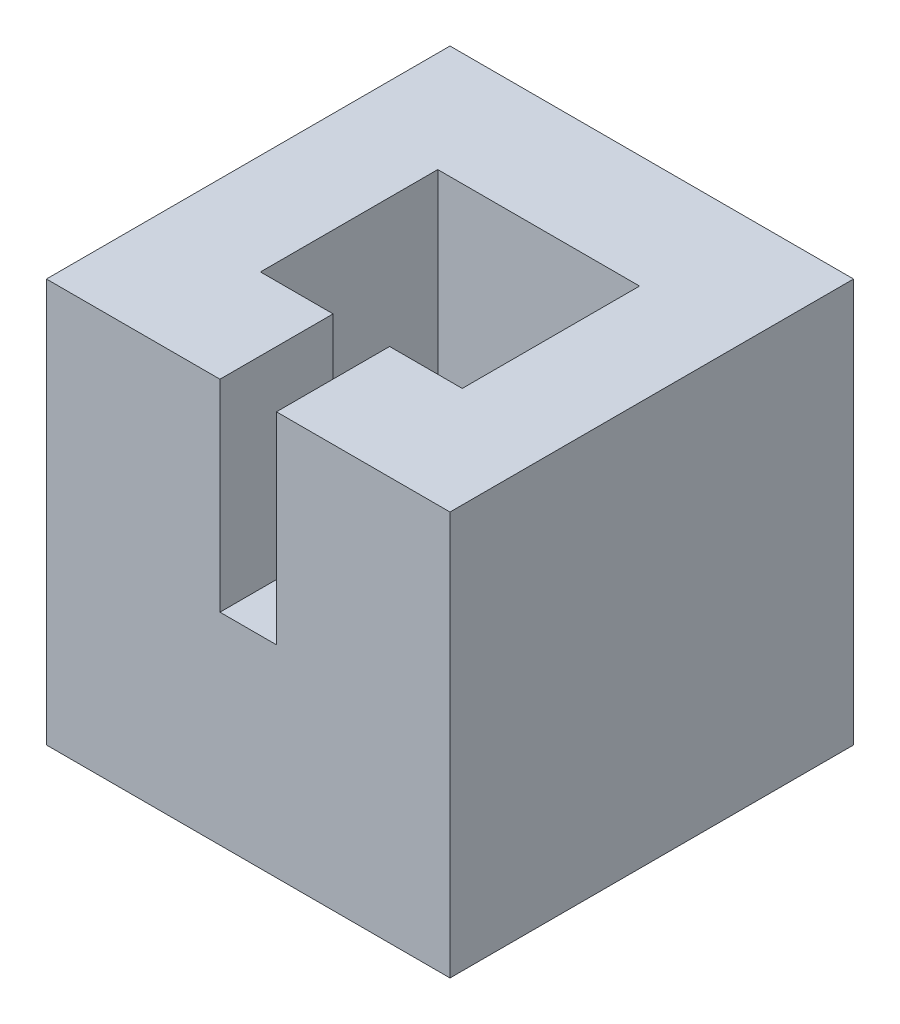
ISO-10303-21;
HEADER;
FILE_DESCRIPTION(('STEP AP214'),'2;1');
FILE_NAME('part.step','',(''),(''),'','','');
FILE_SCHEMA(('AUTOMOTIVE_DESIGN { 1 0 10303 214 1 1 1 1 }'));
ENDSEC;
DATA;
#1=APPLICATION_CONTEXT('core data for automotive mechanical design processes');
#2=APPLICATION_PROTOCOL_DEFINITION('international standard','automotive_design',2000,#1);
#3=PRODUCT_CONTEXT('',#1,'mechanical');
#4=PRODUCT('Part','Part','',(#3));
#5=PRODUCT_RELATED_PRODUCT_CATEGORY('part','',(#4));
#6=PRODUCT_DEFINITION_FORMATION('','',#4);
#7=PRODUCT_DEFINITION_CONTEXT('part definition',#1,'design');
#8=PRODUCT_DEFINITION('design','',#6,#7);
#9=PRODUCT_DEFINITION_SHAPE('','',#8);
#10=(LENGTH_UNIT() NAMED_UNIT(*) SI_UNIT(.MILLI.,.METRE.));
#11=(NAMED_UNIT(*) PLANE_ANGLE_UNIT() SI_UNIT($,.RADIAN.));
#12=(NAMED_UNIT(*) SI_UNIT($,.STERADIAN.) SOLID_ANGLE_UNIT());
#13=UNCERTAINTY_MEASURE_WITH_UNIT(LENGTH_MEASURE(1.E-05),#10,'distance_accuracy_value','');
#14=(GEOMETRIC_REPRESENTATION_CONTEXT(3) GLOBAL_UNCERTAINTY_ASSIGNED_CONTEXT((#13)) GLOBAL_UNIT_ASSIGNED_CONTEXT((#10,
#11,#12)) REPRESENTATION_CONTEXT('',''));
#15=CARTESIAN_POINT('',(0.,0.,0.));
#16=DIRECTION('',(0.,0.,1.));
#17=DIRECTION('',(1.,0.,0.));
#18=AXIS2_PLACEMENT_3D('',#15,#16,#17);
#19=CARTESIAN_POINT('',(6.35,12.7,6.35));
#20=DIRECTION('',(-1.,0.,0.));
#21=DIRECTION('',(0.,0.,1.));
#22=AXIS2_PLACEMENT_3D('',#19,#20,#21);
#23=PLANE('',#22);
#24=DIRECTION('',(0.,0.,-1.));
#25=VECTOR('',#24,1.);
#26=CARTESIAN_POINT('',(6.35,0.,6.35));
#27=LINE('',#26,#25);
#28=CARTESIAN_POINT('',(6.35,0.,6.35));
#29=VERTEX_POINT('',#28);
#30=CARTESIAN_POINT('',(6.35,0.,-6.35));
#31=VERTEX_POINT('',#30);
#32=EDGE_CURVE('E188',#29,#31,#27,.T.);
#33=ORIENTED_EDGE('',*,*,#32,.T.);
#34=DIRECTION('',(0.,-1.,0.));
#35=VECTOR('',#34,1.);
#36=CARTESIAN_POINT('',(6.35,12.7,-6.35));
#37=LINE('',#36,#35);
#38=CARTESIAN_POINT('',(6.35,12.7,-6.35));
#39=VERTEX_POINT('',#38);
#40=EDGE_CURVE('E11',#39,#31,#37,.T.);
#41=ORIENTED_EDGE('',*,*,#40,.F.);
#42=DIRECTION('',(0.,0.,-1.));
#43=VECTOR('',#42,1.);
#44=CARTESIAN_POINT('',(6.35,12.7,6.35));
#45=LINE('',#44,#43);
#46=CARTESIAN_POINT('',(6.35,12.7,6.35));
#47=VERTEX_POINT('',#46);
#48=EDGE_CURVE('E201',#47,#39,#45,.T.);
#49=ORIENTED_EDGE('',*,*,#48,.F.);
#50=DIRECTION('',(0.,-1.,0.));
#51=VECTOR('',#50,1.);
#52=CARTESIAN_POINT('',(6.35,12.7,6.35));
#53=LINE('',#52,#51);
#54=EDGE_CURVE('E209',#47,#29,#53,.T.);
#55=ORIENTED_EDGE('',*,*,#54,.T.);
#56=EDGE_LOOP('',(#33,#41,#49,#55));
#57=FACE_BOUND('',#56,.T.);
#58=ADVANCED_FACE('F37',(#57),#23,.F.);
#59=CARTESIAN_POINT('',(-6.35,12.7,-6.35));
#60=DIRECTION('',(0.,0.,1.));
#61=DIRECTION('',(1.,0.,0.));
#62=AXIS2_PLACEMENT_3D('',#59,#60,#61);
#63=PLANE('',#62);
#64=DIRECTION('',(-1.,0.,0.));
#65=VECTOR('',#64,1.);
#66=CARTESIAN_POINT('',(-6.35,0.,-6.35));
#67=LINE('',#66,#65);
#68=CARTESIAN_POINT('',(-6.35,0.,-6.35));
#69=VERTEX_POINT('',#68);
#70=EDGE_CURVE('E212',#31,#69,#67,.T.);
#71=ORIENTED_EDGE('',*,*,#70,.T.);
#72=DIRECTION('',(0.,-1.,0.));
#73=VECTOR('',#72,1.);
#74=CARTESIAN_POINT('',(-6.35,12.7,-6.35));
#75=LINE('',#74,#73);
#76=CARTESIAN_POINT('',(-6.35,12.7,-6.35));
#77=VERTEX_POINT('',#76);
#78=EDGE_CURVE('E44',#77,#69,#75,.T.);
#79=ORIENTED_EDGE('',*,*,#78,.F.);
#80=DIRECTION('',(-1.,0.,0.));
#81=VECTOR('',#80,1.);
#82=CARTESIAN_POINT('',(-6.35,12.7,-6.35));
#83=LINE('',#82,#81);
#84=EDGE_CURVE('E89',#39,#77,#83,.T.);
#85=ORIENTED_EDGE('',*,*,#84,.F.);
#86=ORIENTED_EDGE('',*,*,#40,.T.);
#87=EDGE_LOOP('',(#71,#79,#85,#86));
#88=FACE_BOUND('',#87,.T.);
#89=ADVANCED_FACE('F262',(#88),#63,.F.);
#90=CARTESIAN_POINT('',(-6.35,12.7,6.35));
#91=DIRECTION('',(1.,0.,0.));
#92=DIRECTION('',(0.,0.,-1.));
#93=AXIS2_PLACEMENT_3D('',#90,#91,#92);
#94=PLANE('',#93);
#95=DIRECTION('',(0.,0.,1.));
#96=VECTOR('',#95,1.);
#97=CARTESIAN_POINT('',(-6.35,0.,6.35));
#98=LINE('',#97,#96);
#99=CARTESIAN_POINT('',(-6.35,0.,6.35));
#100=VERTEX_POINT('',#99);
#101=EDGE_CURVE('E214',#69,#100,#98,.T.);
#102=ORIENTED_EDGE('',*,*,#101,.T.);
#103=DIRECTION('',(0.,-1.,0.));
#104=VECTOR('',#103,1.);
#105=CARTESIAN_POINT('',(-6.35,12.7,6.35));
#106=LINE('',#105,#104);
#107=CARTESIAN_POINT('',(-6.35,12.7,6.35));
#108=VERTEX_POINT('',#107);
#109=EDGE_CURVE('E218',#108,#100,#106,.T.);
#110=ORIENTED_EDGE('',*,*,#109,.F.);
#111=DIRECTION('',(0.,0.,1.));
#112=VECTOR('',#111,1.);
#113=CARTESIAN_POINT('',(-6.35,12.7,6.35));
#114=LINE('',#113,#112);
#115=EDGE_CURVE('E204',#77,#108,#114,.T.);
#116=ORIENTED_EDGE('',*,*,#115,.F.);
#117=ORIENTED_EDGE('',*,*,#78,.T.);
#118=EDGE_LOOP('',(#102,#110,#116,#117));
#119=FACE_BOUND('',#118,.T.);
#120=ADVANCED_FACE('F223',(#119),#94,.F.);
#121=CARTESIAN_POINT('',(-6.35,12.7,6.35));
#122=DIRECTION('',(0.,0.,-1.));
#123=DIRECTION('',(-1.,0.,0.));
#124=AXIS2_PLACEMENT_3D('',#121,#122,#123);
#125=PLANE('',#124);
#126=DIRECTION('',(1.,0.,0.));
#127=VECTOR('',#126,1.);
#128=CARTESIAN_POINT('',(-6.35,12.7,6.35));
#129=LINE('',#128,#127);
#130=CARTESIAN_POINT('',(0.889,12.7,6.35));
#131=VERTEX_POINT('',#130);
#132=EDGE_CURVE('E60',#131,#47,#129,.T.);
#133=ORIENTED_EDGE('',*,*,#132,.F.);
#134=DIRECTION('',(0.,1.,0.));
#135=VECTOR('',#134,1.);
#136=CARTESIAN_POINT('',(0.889,6.35000000000001,6.35));
#137=LINE('',#136,#135);
#138=CARTESIAN_POINT('',(0.889,6.35000000000001,6.35));
#139=VERTEX_POINT('',#138);
#140=EDGE_CURVE('E191',#139,#131,#137,.T.);
#141=ORIENTED_EDGE('',*,*,#140,.F.);
#142=DIRECTION('',(1.,0.,0.));
#143=VECTOR('',#142,1.);
#144=CARTESIAN_POINT('',(0.,6.35000000000001,6.35));
#145=LINE('',#144,#143);
#146=CARTESIAN_POINT('',(-0.889,6.35000000000001,6.35));
#147=VERTEX_POINT('',#146);
#148=EDGE_CURVE('E169',#147,#139,#145,.T.);
#149=ORIENTED_EDGE('',*,*,#148,.F.);
#150=DIRECTION('',(0.,1.,0.));
#151=VECTOR('',#150,1.);
#152=CARTESIAN_POINT('',(-0.889,6.35000000000001,6.35));
#153=LINE('',#152,#151);
#154=CARTESIAN_POINT('',(-0.889,12.7,6.35));
#155=VERTEX_POINT('',#154);
#156=EDGE_CURVE('E193',#147,#155,#153,.T.);
#157=ORIENTED_EDGE('',*,*,#156,.T.);
#158=EDGE_CURVE('E206',#108,#155,#129,.T.);
#159=ORIENTED_EDGE('',*,*,#158,.F.);
#160=ORIENTED_EDGE('',*,*,#109,.T.);
#161=DIRECTION('',(1.,0.,0.));
#162=VECTOR('',#161,1.);
#163=CARTESIAN_POINT('',(-6.35,0.,6.35));
#164=LINE('',#163,#162);
#165=EDGE_CURVE('E82',#100,#29,#164,.T.);
#166=ORIENTED_EDGE('',*,*,#165,.T.);
#167=ORIENTED_EDGE('',*,*,#54,.F.);
#168=EDGE_LOOP('',(#133,#141,#149,#157,#159,#160,#166,#167));
#169=FACE_BOUND('',#168,.T.);
#170=ADVANCED_FACE('F231',(#169),#125,.F.);
#171=CARTESIAN_POINT('',(0.,12.7,0.));
#172=DIRECTION('',(0.,-1.,0.));
#173=DIRECTION('',(0.,0.,-1.));
#174=AXIS2_PLACEMENT_3D('',#171,#172,#173);
#175=PLANE('',#174);
#176=DIRECTION('',(1.,0.,0.));
#177=VECTOR('',#176,1.);
#178=CARTESIAN_POINT('',(0.,12.7,2.7899975875471));
#179=LINE('',#178,#177);
#180=CARTESIAN_POINT('',(0.889,12.7,2.7899975875471));
#181=VERTEX_POINT('',#180);
#182=CARTESIAN_POINT('',(3.175,12.7,2.7899975875471));
#183=VERTEX_POINT('',#182);
#184=EDGE_CURVE('E156',#181,#183,#179,.T.);
#185=ORIENTED_EDGE('',*,*,#184,.F.);
#186=DIRECTION('',(0.,0.,-1.));
#187=VECTOR('',#186,1.);
#188=CARTESIAN_POINT('',(0.889,12.7,0.));
#189=LINE('',#188,#187);
#190=EDGE_CURVE('E159',#131,#181,#189,.T.);
#191=ORIENTED_EDGE('',*,*,#190,.F.);
#192=ORIENTED_EDGE('',*,*,#132,.T.);
#193=ORIENTED_EDGE('',*,*,#48,.T.);
#194=ORIENTED_EDGE('',*,*,#84,.T.);
#195=ORIENTED_EDGE('',*,*,#115,.T.);
#196=ORIENTED_EDGE('',*,*,#158,.T.);
#197=DIRECTION('',(0.,0.,-1.));
#198=VECTOR('',#197,1.);
#199=CARTESIAN_POINT('',(-0.889,12.7,0.));
#200=LINE('',#199,#198);
#201=CARTESIAN_POINT('',(-0.889,12.7,2.7899975875471));
#202=VERTEX_POINT('',#201);
#203=EDGE_CURVE('E181',#155,#202,#200,.T.);
#204=ORIENTED_EDGE('',*,*,#203,.T.);
#205=CARTESIAN_POINT('',(-3.175,12.7,2.7899975875471));
#206=VERTEX_POINT('',#205);
#207=EDGE_CURVE('E161',#206,#202,#179,.T.);
#208=ORIENTED_EDGE('',*,*,#207,.F.);
#209=DIRECTION('',(0.,0.,1.));
#210=VECTOR('',#209,1.);
#211=CARTESIAN_POINT('',(-3.175,12.7,0.));
#212=LINE('',#211,#210);
#213=CARTESIAN_POINT('',(-3.175,12.7,-2.7899975875471));
#214=VERTEX_POINT('',#213);
#215=EDGE_CURVE('E177',#214,#206,#212,.T.);
#216=ORIENTED_EDGE('',*,*,#215,.F.);
#217=DIRECTION('',(1.,0.,0.));
#218=VECTOR('',#217,1.);
#219=CARTESIAN_POINT('',(0.,12.7,-2.7899975875471));
#220=LINE('',#219,#218);
#221=CARTESIAN_POINT('',(3.175,12.7,-2.7899975875471));
#222=VERTEX_POINT('',#221);
#223=EDGE_CURVE('E175',#214,#222,#220,.T.);
#224=ORIENTED_EDGE('',*,*,#223,.T.);
#225=DIRECTION('',(0.,0.,1.));
#226=VECTOR('',#225,1.);
#227=CARTESIAN_POINT('',(3.175,12.7,0.));
#228=LINE('',#227,#226);
#229=EDGE_CURVE('E51',#222,#183,#228,.T.);
#230=ORIENTED_EDGE('',*,*,#229,.T.);
#231=EDGE_LOOP('',(#185,#191,#192,#193,#194,#195,#196,#204,#208,#216,#224,#230));
#232=FACE_BOUND('',#231,.T.);
#233=ADVANCED_FACE('F237',(#232),#175,.F.);
#234=CARTESIAN_POINT('',(0.,0.,0.));
#235=DIRECTION('',(0.,-1.,0.));
#236=DIRECTION('',(0.,0.,-1.));
#237=AXIS2_PLACEMENT_3D('',#234,#235,#236);
#238=PLANE('',#237);
#239=ORIENTED_EDGE('',*,*,#32,.F.);
#240=ORIENTED_EDGE('',*,*,#165,.F.);
#241=ORIENTED_EDGE('',*,*,#101,.F.);
#242=ORIENTED_EDGE('',*,*,#70,.F.);
#243=EDGE_LOOP('',(#239,#240,#241,#242));
#244=FACE_BOUND('',#243,.T.);
#245=ADVANCED_FACE('F227',(#244),#238,.T.);
#246=CARTESIAN_POINT('',(3.175,6.35000000000001,0.));
#247=DIRECTION('',(-1.,0.,0.));
#248=DIRECTION('',(0.,0.,1.));
#249=AXIS2_PLACEMENT_3D('',#246,#247,#248);
#250=PLANE('',#249);
#251=ORIENTED_EDGE('',*,*,#229,.F.);
#252=DIRECTION('',(0.,1.,0.));
#253=VECTOR('',#252,1.);
#254=CARTESIAN_POINT('',(3.175,6.35000000000001,-2.7899975875471));
#255=LINE('',#254,#253);
#256=CARTESIAN_POINT('',(3.175,6.35000000000001,-2.7899975875471));
#257=VERTEX_POINT('',#256);
#258=EDGE_CURVE('E138',#257,#222,#255,.T.);
#259=ORIENTED_EDGE('',*,*,#258,.F.);
#260=DIRECTION('',(0.,0.,1.));
#261=VECTOR('',#260,1.);
#262=CARTESIAN_POINT('',(3.175,6.35000000000001,0.));
#263=LINE('',#262,#261);
#264=CARTESIAN_POINT('',(3.175,6.35000000000001,2.7899975875471));
#265=VERTEX_POINT('',#264);
#266=EDGE_CURVE('E146',#257,#265,#263,.T.);
#267=ORIENTED_EDGE('',*,*,#266,.T.);
#268=DIRECTION('',(0.,1.,0.));
#269=VECTOR('',#268,1.);
#270=CARTESIAN_POINT('',(3.175,6.35000000000001,2.7899975875471));
#271=LINE('',#270,#269);
#272=EDGE_CURVE('E186',#265,#183,#271,.T.);
#273=ORIENTED_EDGE('',*,*,#272,.T.);
#274=EDGE_LOOP('',(#251,#259,#267,#273));
#275=FACE_BOUND('',#274,.T.);
#276=ADVANCED_FACE('F148',(#275),#250,.T.);
#277=CARTESIAN_POINT('',(0.,6.35000000000001,2.7899975875471));
#278=DIRECTION('',(0.,0.,1.));
#279=DIRECTION('',(1.,0.,0.));
#280=AXIS2_PLACEMENT_3D('',#277,#278,#279);
#281=PLANE('',#280);
#282=ORIENTED_EDGE('',*,*,#184,.T.);
#283=ORIENTED_EDGE('',*,*,#272,.F.);
#284=DIRECTION('',(1.,0.,0.));
#285=VECTOR('',#284,1.);
#286=CARTESIAN_POINT('',(0.,6.35000000000001,2.7899975875471));
#287=LINE('',#286,#285);
#288=CARTESIAN_POINT('',(0.889,6.35000000000001,2.7899975875471));
#289=VERTEX_POINT('',#288);
#290=EDGE_CURVE('E150',#289,#265,#287,.T.);
#291=ORIENTED_EDGE('',*,*,#290,.F.);
#292=DIRECTION('',(0.,1.,0.));
#293=VECTOR('',#292,1.);
#294=CARTESIAN_POINT('',(0.889,6.35000000000001,2.7899975875471));
#295=LINE('',#294,#293);
#296=EDGE_CURVE('E189',#289,#181,#295,.T.);
#297=ORIENTED_EDGE('',*,*,#296,.T.);
#298=EDGE_LOOP('',(#282,#283,#291,#297));
#299=FACE_BOUND('',#298,.T.);
#300=ADVANCED_FACE('F239',(#299),#281,.F.);
#301=CARTESIAN_POINT('',(0.889,6.35000000000001,0.));
#302=DIRECTION('',(1.,0.,0.));
#303=DIRECTION('',(0.,0.,-1.));
#304=AXIS2_PLACEMENT_3D('',#301,#302,#303);
#305=PLANE('',#304);
#306=ORIENTED_EDGE('',*,*,#190,.T.);
#307=ORIENTED_EDGE('',*,*,#296,.F.);
#308=DIRECTION('',(0.,0.,-1.));
#309=VECTOR('',#308,1.);
#310=CARTESIAN_POINT('',(0.889,6.35000000000001,0.));
#311=LINE('',#310,#309);
#312=EDGE_CURVE('E172',#139,#289,#311,.T.);
#313=ORIENTED_EDGE('',*,*,#312,.F.);
#314=ORIENTED_EDGE('',*,*,#140,.T.);
#315=EDGE_LOOP('',(#306,#307,#313,#314));
#316=FACE_BOUND('',#315,.T.);
#317=ADVANCED_FACE('F235',(#316),#305,.F.);
#318=CARTESIAN_POINT('',(-0.889,6.35000000000001,0.));
#319=DIRECTION('',(1.,0.,0.));
#320=DIRECTION('',(0.,0.,-1.));
#321=AXIS2_PLACEMENT_3D('',#318,#319,#320);
#322=PLANE('',#321);
#323=ORIENTED_EDGE('',*,*,#203,.F.);
#324=ORIENTED_EDGE('',*,*,#156,.F.);
#325=DIRECTION('',(0.,0.,-1.));
#326=VECTOR('',#325,1.);
#327=CARTESIAN_POINT('',(-0.889,6.35000000000001,0.));
#328=LINE('',#327,#326);
#329=CARTESIAN_POINT('',(-0.889,6.35000000000001,2.7899975875471));
#330=VERTEX_POINT('',#329);
#331=EDGE_CURVE('E167',#147,#330,#328,.T.);
#332=ORIENTED_EDGE('',*,*,#331,.T.);
#333=DIRECTION('',(0.,1.,0.));
#334=VECTOR('',#333,1.);
#335=CARTESIAN_POINT('',(-0.889,6.35000000000001,2.7899975875471));
#336=LINE('',#335,#334);
#337=EDGE_CURVE('E196',#330,#202,#336,.T.);
#338=ORIENTED_EDGE('',*,*,#337,.T.);
#339=EDGE_LOOP('',(#323,#324,#332,#338));
#340=FACE_BOUND('',#339,.T.);
#341=ADVANCED_FACE('F244',(#340),#322,.T.);
#342=ORIENTED_EDGE('',*,*,#207,.T.);
#343=ORIENTED_EDGE('',*,*,#337,.F.);
#344=CARTESIAN_POINT('',(-3.175,6.35000000000001,2.7899975875471));
#345=VERTEX_POINT('',#344);
#346=EDGE_CURVE('E164',#345,#330,#287,.T.);
#347=ORIENTED_EDGE('',*,*,#346,.F.);
#348=DIRECTION('',(0.,1.,0.));
#349=VECTOR('',#348,1.);
#350=CARTESIAN_POINT('',(-3.175,6.35000000000001,2.7899975875471));
#351=LINE('',#350,#349);
#352=EDGE_CURVE('E198',#345,#206,#351,.T.);
#353=ORIENTED_EDGE('',*,*,#352,.T.);
#354=EDGE_LOOP('',(#342,#343,#347,#353));
#355=FACE_BOUND('',#354,.T.);
#356=ADVANCED_FACE('F246',(#355),#281,.F.);
#357=CARTESIAN_POINT('',(-3.175,6.35000000000001,0.));
#358=DIRECTION('',(-1.,0.,0.));
#359=DIRECTION('',(0.,0.,1.));
#360=AXIS2_PLACEMENT_3D('',#357,#358,#359);
#361=PLANE('',#360);
#362=ORIENTED_EDGE('',*,*,#215,.T.);
#363=ORIENTED_EDGE('',*,*,#352,.F.);
#364=DIRECTION('',(0.,0.,1.));
#365=VECTOR('',#364,1.);
#366=CARTESIAN_POINT('',(-3.175,6.35000000000001,0.));
#367=LINE('',#366,#365);
#368=CARTESIAN_POINT('',(-3.175,6.35000000000001,-2.7899975875471));
#369=VERTEX_POINT('',#368);
#370=EDGE_CURVE('E145',#369,#345,#367,.T.);
#371=ORIENTED_EDGE('',*,*,#370,.F.);
#372=DIRECTION('',(0.,1.,0.));
#373=VECTOR('',#372,1.);
#374=CARTESIAN_POINT('',(-3.175,6.35000000000001,-2.7899975875471));
#375=LINE('',#374,#373);
#376=EDGE_CURVE('E140',#369,#214,#375,.T.);
#377=ORIENTED_EDGE('',*,*,#376,.T.);
#378=EDGE_LOOP('',(#362,#363,#371,#377));
#379=FACE_BOUND('',#378,.T.);
#380=ADVANCED_FACE('F251',(#379),#361,.F.);
#381=CARTESIAN_POINT('',(0.,6.35000000000001,-2.7899975875471));
#382=DIRECTION('',(0.,0.,1.));
#383=DIRECTION('',(1.,0.,0.));
#384=AXIS2_PLACEMENT_3D('',#381,#382,#383);
#385=PLANE('',#384);
#386=ORIENTED_EDGE('',*,*,#223,.F.);
#387=ORIENTED_EDGE('',*,*,#376,.F.);
#388=DIRECTION('',(1.,0.,0.));
#389=VECTOR('',#388,1.);
#390=CARTESIAN_POINT('',(0.,6.35000000000001,-2.7899975875471));
#391=LINE('',#390,#389);
#392=EDGE_CURVE('E135',#369,#257,#391,.T.);
#393=ORIENTED_EDGE('',*,*,#392,.T.);
#394=ORIENTED_EDGE('',*,*,#258,.T.);
#395=EDGE_LOOP('',(#386,#387,#393,#394));
#396=FACE_BOUND('',#395,.T.);
#397=ADVANCED_FACE('F137',(#396),#385,.T.);
#398=CARTESIAN_POINT('',(0.,6.35000000000001,0.));
#399=DIRECTION('',(0.,1.,0.));
#400=DIRECTION('',(0.,0.,1.));
#401=AXIS2_PLACEMENT_3D('',#398,#399,#400);
#402=PLANE('',#401);
#403=ORIENTED_EDGE('',*,*,#266,.F.);
#404=ORIENTED_EDGE('',*,*,#392,.F.);
#405=ORIENTED_EDGE('',*,*,#370,.T.);
#406=ORIENTED_EDGE('',*,*,#346,.T.);
#407=ORIENTED_EDGE('',*,*,#331,.F.);
#408=ORIENTED_EDGE('',*,*,#148,.T.);
#409=ORIENTED_EDGE('',*,*,#312,.T.);
#410=ORIENTED_EDGE('',*,*,#290,.T.);
#411=EDGE_LOOP('',(#403,#404,#405,#406,#407,#408,#409,#410));
#412=FACE_BOUND('',#411,.T.);
#413=ADVANCED_FACE('F153',(#412),#402,.T.);
#414=CLOSED_SHELL('',(#58,#89,#120,#170,#233,#245,#276,#300,#317,#341,#356,#380,#397,#413));
#415=MANIFOLD_SOLID_BREP('B2',#414);
#416=ADVANCED_BREP_SHAPE_REPRESENTATION('',(#18,#415),#14);
#417=SHAPE_DEFINITION_REPRESENTATION(#9,#416);
ENDSEC;
END-ISO-10303-21;
